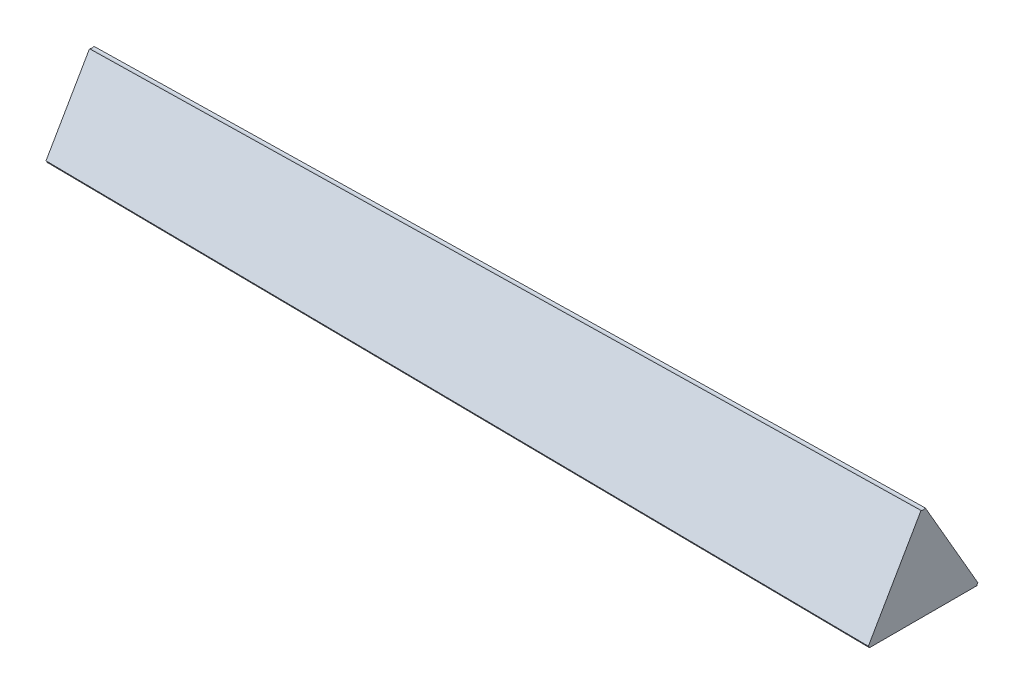
ISO-10303-21;
HEADER;
FILE_DESCRIPTION(('STEP AP214'),'2;1');
FILE_NAME('part.step','',(''),(''),'','','');
FILE_SCHEMA(('AUTOMOTIVE_DESIGN { 1 0 10303 214 1 1 1 1 }'));
ENDSEC;
DATA;
#1=APPLICATION_CONTEXT('core data for automotive mechanical design processes');
#2=APPLICATION_PROTOCOL_DEFINITION('international standard','automotive_design',2000,#1);
#3=PRODUCT_CONTEXT('',#1,'mechanical');
#4=PRODUCT('Part','Part','',(#3));
#5=PRODUCT_RELATED_PRODUCT_CATEGORY('part','',(#4));
#6=PRODUCT_DEFINITION_FORMATION('','',#4);
#7=PRODUCT_DEFINITION_CONTEXT('part definition',#1,'design');
#8=PRODUCT_DEFINITION('design','',#6,#7);
#9=PRODUCT_DEFINITION_SHAPE('','',#8);
#10=(LENGTH_UNIT() NAMED_UNIT(*) SI_UNIT(.MILLI.,.METRE.));
#11=(NAMED_UNIT(*) PLANE_ANGLE_UNIT() SI_UNIT($,.RADIAN.));
#12=(NAMED_UNIT(*) SI_UNIT($,.STERADIAN.) SOLID_ANGLE_UNIT());
#13=UNCERTAINTY_MEASURE_WITH_UNIT(LENGTH_MEASURE(1.E-05),#10,'distance_accuracy_value','');
#14=(GEOMETRIC_REPRESENTATION_CONTEXT(3) GLOBAL_UNCERTAINTY_ASSIGNED_CONTEXT((#13)) GLOBAL_UNIT_ASSIGNED_CONTEXT((#10,
#11,#12)) REPRESENTATION_CONTEXT('',''));
#15=CARTESIAN_POINT('',(0.,0.,0.));
#16=DIRECTION('',(0.,0.,1.));
#17=DIRECTION('',(1.,0.,0.));
#18=AXIS2_PLACEMENT_3D('',#15,#16,#17);
#19=CARTESIAN_POINT('',(6096.,200.,0.));
#20=DIRECTION('',(-1.,0.,0.));
#21=DIRECTION('',(0.,-1.,0.));
#22=AXIS2_PLACEMENT_3D('',#19,#20,#21);
#23=PLANE('',#22);
#24=CARTESIAN_POINT('',(6096.,0.,82.0018386876281));
#25=DIRECTION('',(1.,0.,0.));
#26=DIRECTION('',(0.,1.,0.));
#27=AXIS2_PLACEMENT_3D('',#24,#25,#26);
#28=CIRCLE('',#27,3.2258);
#29=CARTESIAN_POINT('',(6096.,0.,78.7760386876281));
#30=VERTEX_POINT('',#29);
#31=CARTESIAN_POINT('',(6096.,2.79348621840737,80.3886987719457));
#32=VERTEX_POINT('',#31);
#33=EDGE_CURVE('E140',#30,#32,#28,.T.);
#34=ORIENTED_EDGE('',*,*,#33,.F.);
#35=DIRECTION('',(0.,0.,-1.));
#36=VECTOR('',#35,1.);
#37=CARTESIAN_POINT('',(6096.,0.,0.));
#38=LINE('',#37,#36);
#39=CARTESIAN_POINT('',(6096.,0.,-78.7760386876281));
#40=VERTEX_POINT('',#39);
#41=EDGE_CURVE('E146',#30,#40,#38,.T.);
#42=ORIENTED_EDGE('',*,*,#41,.T.);
#43=CARTESIAN_POINT('',(6096.,0.,-82.0018386876281));
#44=DIRECTION('',(1.,0.,0.));
#45=DIRECTION('',(0.,1.,0.));
#46=AXIS2_PLACEMENT_3D('',#43,#44,#45);
#47=CIRCLE('',#46,3.2258);
#48=CARTESIAN_POINT('',(6096.,2.79348621840737,-80.3886987719456));
#49=VERTEX_POINT('',#48);
#50=EDGE_CURVE('E248',#49,#40,#47,.T.);
#51=ORIENTED_EDGE('',*,*,#50,.F.);
#52=CARTESIAN_POINT('',(6096.,0.,-82.0018386876281));
#53=CARTESIAN_POINT('',(6096.,13.7748221333112,-74.04736399996));
#54=CARTESIAN_POINT('',(6096.,27.5496442666224,-66.0928893122919));
#55=CARTESIAN_POINT('',(6096.,55.0992885332448,-50.1839399369556));
#56=CARTESIAN_POINT('',(6096.,68.8741106665559,-42.2294652492875));
#57=CARTESIAN_POINT('',(6096.,102.43368361185,-22.8499937077462));
#58=CARTESIAN_POINT('',(6096.,122.218434423834,-11.4249968538731));
#59=CARTESIAN_POINT('',(6096.,142.003185235817,0.));
#60=B_SPLINE_CURVE_WITH_KNOTS('',3,(#52,#53,#54,#55,#56,#57,#58,#59),.UNSPECIFIED.,.F.,.F.,(4,2,
2,4),(0.,47.7197499076642,95.4394998153284,163.979285781069),.UNSPECIFIED.);
#61=CARTESIAN_POINT('',(6096.,136.504196616905,-3.17547227496557));
#62=VERTEX_POINT('',#61);
#63=EDGE_CURVE('E194',#49,#62,#60,.T.);
#64=ORIENTED_EDGE('',*,*,#63,.T.);
#65=CARTESIAN_POINT('',(6096.,142.003185235817,0.));
#66=DIRECTION('',(1.,0.,0.));
#67=DIRECTION('',(0.,1.,0.));
#68=AXIS2_PLACEMENT_3D('',#65,#66,#67);
#69=CIRCLE('',#68,6.35);
#70=CARTESIAN_POINT('',(6096.,136.504196616905,3.17547227496557));
#71=VERTEX_POINT('',#70);
#72=EDGE_CURVE('E258',#71,#62,#69,.T.);
#73=ORIENTED_EDGE('',*,*,#72,.F.);
#74=CARTESIAN_POINT('',(6096.,142.003185235817,0.));
#75=CARTESIAN_POINT('',(6096.,128.228363102506,7.95447468766816));
#76=CARTESIAN_POINT('',(6096.,114.453540969194,15.9089493753363));
#77=CARTESIAN_POINT('',(6096.,86.903896702572,31.8178987506726));
#78=CARTESIAN_POINT('',(6096.,73.1290745692608,39.7723734383407));
#79=CARTESIAN_POINT('',(6096.,39.5695016239664,59.1518449798819));
#80=CARTESIAN_POINT('',(6096.,19.7847508119832,70.576841833755));
#81=CARTESIAN_POINT('',(6096.,0.,82.0018386876282));
#82=B_SPLINE_CURVE_WITH_KNOTS('',3,(#74,#75,#76,#77,#78,#79,#80,#81),.UNSPECIFIED.,.F.,.F.,(4,2,
2,4),(0.,47.7197499076642,95.4394998153285,163.979285781069),.UNSPECIFIED.);
#83=EDGE_CURVE('E187',#71,#32,#82,.T.);
#84=ORIENTED_EDGE('',*,*,#83,.T.);
#85=EDGE_LOOP('',(#34,#42,#51,#64,#73,#84));
#86=FACE_BOUND('',#85,.T.);
#87=ADVANCED_FACE('F120',(#86),#23,.F.);
#88=CARTESIAN_POINT('',(4876.8,200.,0.));
#89=DIRECTION('',(-1.,0.,0.));
#90=DIRECTION('',(0.,-1.,0.));
#91=AXIS2_PLACEMENT_3D('',#88,#89,#90);
#92=PLANE('',#91);
#93=DIRECTION('',(0.,0.,-1.));
#94=VECTOR('',#93,1.);
#95=CARTESIAN_POINT('',(4876.8,0.,0.));
#96=LINE('',#95,#94);
#97=CARTESIAN_POINT('',(4876.8,0.,65.3256709501025));
#98=VERTEX_POINT('',#97);
#99=CARTESIAN_POINT('',(4876.8,0.,-65.3256709501025));
#100=VERTEX_POINT('',#99);
#101=EDGE_CURVE('E191',#98,#100,#96,.T.);
#102=ORIENTED_EDGE('',*,*,#101,.F.);
#103=CARTESIAN_POINT('',(4876.8,0.,68.5514709501025));
#104=DIRECTION('',(-1.,0.,0.));
#105=DIRECTION('',(0.,0.,1.));
#106=AXIS2_PLACEMENT_3D('',#103,#104,#105);
#107=CIRCLE('',#106,3.2258);
#108=CARTESIAN_POINT('',(4876.8,2.7934359788372,66.9382440373163));
#109=VERTEX_POINT('',#108);
#110=EDGE_CURVE('E179',#109,#98,#107,.T.);
#111=ORIENTED_EDGE('',*,*,#110,.F.);
#112=CARTESIAN_POINT('',(4876.8,118.702548188653,0.));
#113=CARTESIAN_POINT('',(4876.8,104.927973789209,7.95490367479582));
#114=CARTESIAN_POINT('',(4876.8,91.1533993897643,15.9098073495917));
#115=CARTESIAN_POINT('',(4876.8,64.4823541585998,31.31250434534));
#116=CARTESIAN_POINT('',(4876.8,51.5858833268799,38.7602976662925));
#117=CARTESIAN_POINT('',(4876.8,25.7929416634399,53.6558843081975));
#118=CARTESIAN_POINT('',(4876.8,12.89647083172,61.10367762915));
#119=CARTESIAN_POINT('',(4876.8,0.,68.5514709501025));
#120=B_SPLINE_CURVE_WITH_KNOTS('',3,(#112,#113,#114,#115,#116,#117,#118,#119),.UNSPECIFIED.,.F.,
.F.,(4,2,2,4),(0.,47.7197499076642,92.3974542733236,137.075158638983),.UNSPECIFIED.);
#121=CARTESIAN_POINT('',(4876.8,113.203658466533,3.17564352910663));
#122=VERTEX_POINT('',#121);
#123=EDGE_CURVE('E233',#122,#109,#120,.T.);
#124=ORIENTED_EDGE('',*,*,#123,.F.);
#125=CARTESIAN_POINT('',(4876.8,118.702548188653,0.));
#126=DIRECTION('',(-1.,0.,0.));
#127=DIRECTION('',(0.,0.,1.));
#128=AXIS2_PLACEMENT_3D('',#125,#126,#127);
#129=CIRCLE('',#128,6.35);
#130=CARTESIAN_POINT('',(4876.8,113.203658466533,-3.17564352910661));
#131=VERTEX_POINT('',#130);
#132=EDGE_CURVE('E244',#131,#122,#129,.T.);
#133=ORIENTED_EDGE('',*,*,#132,.F.);
#134=CARTESIAN_POINT('',(4876.8,0.,-68.5514709501025));
#135=CARTESIAN_POINT('',(4876.8,13.7745743994445,-60.5965672753067));
#136=CARTESIAN_POINT('',(4876.8,27.5491487988891,-52.6416636005109));
#137=CARTESIAN_POINT('',(4876.8,54.2201940300536,-37.2389666047626));
#138=CARTESIAN_POINT('',(4876.8,67.1166648617735,-29.79117328381));
#139=CARTESIAN_POINT('',(4876.8,92.9096065252135,-14.895586641905));
#140=CARTESIAN_POINT('',(4876.8,105.806077356933,-7.44779332095248));
#141=CARTESIAN_POINT('',(4876.8,118.702548188653,0.));
#142=B_SPLINE_CURVE_WITH_KNOTS('',3,(#134,#135,#136,#137,#138,#139,#140,#141),.UNSPECIFIED.,.F.,
.F.,(4,2,2,4),(0.,47.7197499076642,92.3974542733236,137.075158638983),.UNSPECIFIED.);
#143=CARTESIAN_POINT('',(4876.8,2.79343597883728,-66.9382440373163));
#144=VERTEX_POINT('',#143);
#145=EDGE_CURVE('E210',#144,#131,#142,.T.);
#146=ORIENTED_EDGE('',*,*,#145,.F.);
#147=CARTESIAN_POINT('',(4876.8,0.,-68.5514709501025));
#148=DIRECTION('',(-1.,0.,1.3766793038938E-13));
#149=DIRECTION('',(1.3766793038938E-13,0.,1.));
#150=AXIS2_PLACEMENT_3D('',#147,#148,#149);
#151=CIRCLE('',#150,3.2258);
#152=EDGE_CURVE('E182',#100,#144,#151,.T.);
#153=ORIENTED_EDGE('',*,*,#152,.F.);
#154=EDGE_LOOP('',(#102,#111,#124,#133,#146,#153));
#155=FACE_BOUND('',#154,.T.);
#156=ADVANCED_FACE('F222',(#155),#92,.T.);
#157=CARTESIAN_POINT('',(0.,0.,14.75));
#158=DIRECTION('',(0.,-1.,0.));
#159=DIRECTION('',(0.,0.,-1.));
#160=AXIS2_PLACEMENT_3D('',#157,#158,#159);
#161=PLANE('',#160);
#162=ORIENTED_EDGE('',*,*,#41,.F.);
#163=DIRECTION('',(-0.999939151654741,0.,-0.0110314544823701));
#164=VECTOR('',#163,1.);
#165=CARTESIAN_POINT('',(5486.4,0.,72.0508548188653));
#166=LINE('',#165,#164);
#167=EDGE_CURVE('E176',#30,#98,#166,.T.);
#168=ORIENTED_EDGE('',*,*,#167,.T.);
#169=ORIENTED_EDGE('',*,*,#101,.T.);
#170=DIRECTION('',(-0.999939151654741,0.,0.0110314544823701));
#171=VECTOR('',#170,1.);
#172=CARTESIAN_POINT('',(5486.4,0.,-72.0508548188653));
#173=LINE('',#172,#171);
#174=EDGE_CURVE('E133',#100,#40,#173,.F.);
#175=ORIENTED_EDGE('',*,*,#174,.T.);
#176=EDGE_LOOP('',(#162,#168,#169,#175));
#177=FACE_BOUND('',#176,.T.);
#178=ADVANCED_FACE('F122',(#177),#161,.T.);
#179=CARTESIAN_POINT('',(0.,25.5,0.));
#180=CARTESIAN_POINT('',(2438.33333333333,72.1,0.));
#181=CARTESIAN_POINT('',(4876.66666666667,118.7,0.));
#182=CARTESIAN_POINT('',(7315.,165.3,0.));
#183=CARTESIAN_POINT('',(0.,23.375,1.22916666666666));
#184=CARTESIAN_POINT('',(2438.33333333333,66.0916666666667,3.47083333333334));
#185=CARTESIAN_POINT('',(4876.66666666667,108.808333333333,5.71250000000001));
#186=CARTESIAN_POINT('',(7315.,151.525,7.95416666666669));
#187=CARTESIAN_POINT('',(0.,19.125,3.68749999999999));
#188=CARTESIAN_POINT('',(2438.33333333333,54.075,10.4125));
#189=CARTESIAN_POINT('',(4876.66666666667,89.0250000000001,17.1375));
#190=CARTESIAN_POINT('',(7315.,123.975,23.8625));
#191=CARTESIAN_POINT('',(0.,12.75,7.37500000000001));
#192=CARTESIAN_POINT('',(2438.33333333333,36.0499999999999,20.825));
#193=CARTESIAN_POINT('',(4876.66666666667,59.3499999999999,34.275));
#194=CARTESIAN_POINT('',(7315.,82.6499999999999,47.725));
#195=CARTESIAN_POINT('',(0.,6.375,11.0625));
#196=CARTESIAN_POINT('',(2438.33333333333,18.025,31.2375));
#197=CARTESIAN_POINT('',(4876.66666666666,29.675,51.4125));
#198=CARTESIAN_POINT('',(7314.99999999999,41.3250000000001,71.5875));
#199=CARTESIAN_POINT('',(0.,2.125,13.5208333333333));
#200=CARTESIAN_POINT('',(2438.33333333333,6.00833333333333,38.1791666666667));
#201=CARTESIAN_POINT('',(4876.66666666667,9.89166666666667,62.8375));
#202=CARTESIAN_POINT('',(7315.,13.775,87.4958333333333));
#203=CARTESIAN_POINT('',(0.,0.,14.75));
#204=CARTESIAN_POINT('',(2438.33333333333,0.,41.65));
#205=CARTESIAN_POINT('',(4876.66666666667,0.,68.55));
#206=CARTESIAN_POINT('',(7315.,0.,95.45));
#207=B_SPLINE_SURFACE_WITH_KNOTS('',3,3,((#179,#180,#181,#182),(#183,#184,#185,#186),(#187,#188,
#189,#190),(#191,#192,#193,#194),(#195,#196,#197,#198),(#199,#200,#201,#202),(#203,#204,#205,
#206)),.UNSPECIFIED.,.F.,.F.,.F.,(4,1,1,1,4),(4,4),(0.,0.0833123226738553,0.166624645347711,
0.249936968021566,0.333249290695421),(0.,1.),.UNSPECIFIED.);
#208=CARTESIAN_POINT('',(4876.8,2.7934359788372,66.9382440373163));
#209=CARTESIAN_POINT('',(4878.95014078602,2.79343608483086,66.9619648444254));
#210=CARTESIAN_POINT('',(4881.10028157203,2.79343619071443,66.9856856513439));
#211=CARTESIAN_POINT('',(4891.85098550211,2.79343671958356,67.1042896849866));
#212=CARTESIAN_POINT('',(4900.4515486462,2.79343714092293,67.1991729088612));
#213=CARTESIAN_POINT('',(4913.35239336239,2.79343777033079,67.3414977401704));
#214=CARTESIAN_POINT('',(4917.65267493447,2.79343797969988,67.3889393498564));
#215=CARTESIAN_POINT('',(4930.55351965071,2.79343860651454,67.5312641766768));
#216=CARTESIAN_POINT('',(4939.1540827949,2.7934390226675,67.6261473915737));
#217=CARTESIAN_POINT('',(4952.05492751124,2.79343964434351,67.7684722094992));
#218=CARTESIAN_POINT('',(4956.35520908337,2.79343985114327,67.8159138147376));
#219=CARTESIAN_POINT('',(4969.25605379975,2.79344047027365,67.9582386282565));
#220=CARTESIAN_POINT('',(4977.85661694404,2.79344088133535,68.0531218343405));
#221=CARTESIAN_POINT('',(4990.75746166053,2.79344149542108,68.195446639127));
#222=CARTESIAN_POINT('',(4995.0577432327,2.79344169969852,68.2428882399993));
#223=CARTESIAN_POINT('',(5007.95858794923,2.79344231128507,68.3852130404597));
#224=CARTESIAN_POINT('',(5016.55915109362,2.79344271734839,68.4800962378913));
#225=CARTESIAN_POINT('',(5029.45999581025,2.79344332398198,68.6224210297782));
#226=CARTESIAN_POINT('',(5033.76027738246,2.79344352578295,68.6698626263637));
#227=CARTESIAN_POINT('',(5046.66112209914,2.79344412996266,68.8121874140029));
#228=CARTESIAN_POINT('',(5055.26168524362,2.79344453111821,68.907070602939));
#229=CARTESIAN_POINT('',(5068.16252996039,2.79344513043456,69.0493953821595));
#230=CARTESIAN_POINT('',(5072.46281153265,2.79344532980385,69.0968369745357));
#231=CARTESIAN_POINT('',(5085.36365624946,2.79344592671053,69.2391617495849));
#232=CARTESIAN_POINT('',(5093.96421939404,2.79344632304674,69.3340449301787));
#233=CARTESIAN_POINT('',(5106.86506411094,2.7934469151774,69.4763696969606));
#234=CARTESIAN_POINT('',(5111.16534568325,2.79344711215867,69.5238112852031));
#235=CARTESIAN_POINT('',(5124.0661904002,2.79344770192282,69.6661360478885));
#236=CARTESIAN_POINT('',(5132.66675354486,2.79344809352602,69.7610192202892));
#237=CARTESIAN_POINT('',(5145.5675982619,2.79344867859948,69.9033439748548));
#238=CARTESIAN_POINT('',(5149.86787983426,2.79344887323541,69.9507855590374));
#239=CARTESIAN_POINT('',(5162.76872455134,2.79344945598449,70.0931103095793));
#240=CARTESIAN_POINT('',(5171.36928769609,2.79344984293893,70.187993473933));
#241=CARTESIAN_POINT('',(5184.27013241326,2.79345042108059,70.3303182164993));
#242=CARTESIAN_POINT('',(5188.57041398566,2.79345061341281,70.377759796694));
#243=CARTESIAN_POINT('',(5201.47125870288,2.79345118927125,70.520084535308));
#244=CARTESIAN_POINT('',(5210.07182184771,2.79345157165923,70.6149676917569));
#245=CARTESIAN_POINT('',(5222.97266656502,2.79345214299155,70.757292422536));
#246=CARTESIAN_POINT('',(5227.27294813746,2.79345233306071,70.8047339988133));
#247=CARTESIAN_POINT('',(5240.1737928548,2.79345290215,70.9470587257095));
#248=CARTESIAN_POINT('',(5248.77435599972,2.79345328005191,71.0419418743927));
#249=CARTESIAN_POINT('',(5261.67520071715,2.79345384469449,71.1842665935914));
#250=CARTESIAN_POINT('',(5265.97548228964,2.7934540325403,71.23170816602));
#251=CARTESIAN_POINT('',(5274.57604543462,2.79345440749948,71.3265913096092));
#252=CARTESIAN_POINT('',(5278.87632700711,2.79345459461285,71.3740328807698));
#253=CARTESIAN_POINT('',(5291.77717172463,2.79345515486068,71.516357592361));
#254=CARTESIAN_POINT('',(5300.37773486966,2.79345552690289,71.6112407309007));
#255=CARTESIAN_POINT('',(5313.27857958726,2.79345608280707,71.7535654349727));
#256=CARTESIAN_POINT('',(5317.5788611598,2.79345626774862,71.8010070023738));
#257=CARTESIAN_POINT('',(5330.47970587743,2.79345682149991,71.943331702719));
#258=CARTESIAN_POINT('',(5339.08026902255,2.79345718923634,72.0382148338051));
#259=CARTESIAN_POINT('',(5351.98111374027,2.79345773871913,72.1805395267613));
#260=CARTESIAN_POINT('',(5356.28139531285,2.79345792152643,72.2279810904678));
#261=CARTESIAN_POINT('',(5369.18224003061,2.7934584688935,72.3703057797615));
#262=CARTESIAN_POINT('',(5377.78280317581,2.79345883239847,72.4651889035226));
#263=CARTESIAN_POINT('',(5390.68364789365,2.79345937557051,72.6075135855544));
#264=CARTESIAN_POINT('',(5394.98392946627,2.79345955628029,72.65495514563));
#265=CARTESIAN_POINT('',(5407.88477418415,2.79346009737291,72.7972798240621));
#266=CARTESIAN_POINT('',(5416.48533732943,2.79346045671903,72.892162940624));
#267=CARTESIAN_POINT('',(5429.38618204738,2.79346099368845,73.0344876119184));
#268=CARTESIAN_POINT('',(5433.68646362004,2.79346117233663,73.0819291684252));
#269=CARTESIAN_POINT('',(5446.58730833804,2.79346170726208,73.2242538361814));
#270=CARTESIAN_POINT('',(5455.1878714834,2.79346206252029,73.3191369456668));
#271=CARTESIAN_POINT('',(5468.08871620147,2.79346259339268,73.4614616064068));
#272=CARTESIAN_POINT('',(5472.38899777417,2.79346277001432,73.5089031594055));
#273=CARTESIAN_POINT('',(5485.28984249228,2.79346329887746,73.6512278166673));
#274=CARTESIAN_POINT('',(5493.89040563772,2.79346365011717,73.7461109191963));
#275=CARTESIAN_POINT('',(5506.7912503559,2.79346417499581,73.8884355695605));
#276=CARTESIAN_POINT('',(5511.09153192864,2.79346434962519,73.9358771191104));
#277=CARTESIAN_POINT('',(5523.99237664687,2.79346487252846,74.0782017660551));
#278=CARTESIAN_POINT('',(5532.59293979237,2.79346521981745,74.173084861745));
#279=CARTESIAN_POINT('',(5545.49378451068,2.79346573880327,74.3154095019082));
#280=CARTESIAN_POINT('',(5549.79406608345,2.79346591147394,74.3628510480673));
#281=CARTESIAN_POINT('',(5562.69491080179,2.79346642851755,74.5051756848683));
#282=CARTESIAN_POINT('',(5571.29547394737,2.79346677192213,74.6000587738338));
#283=CARTESIAN_POINT('',(5584.19631866578,2.7934672851138,74.7423834039668));
#284=CARTESIAN_POINT('',(5588.49660023859,2.79346745585848,74.7898249467919));
#285=CARTESIAN_POINT('',(5601.39744495704,2.79346796714033,74.9321495736187));
#286=CARTESIAN_POINT('',(5609.9980081027,2.79346830672527,75.0270326559721));
#287=CARTESIAN_POINT('',(5622.89885282122,2.79346881421932,75.1693572762417));
#288=CARTESIAN_POINT('',(5627.19913439407,2.79346898307011,75.2167988157882));
#289=CARTESIAN_POINT('',(5640.09997911262,2.79346948868603,75.3591234328067));
#290=CARTESIAN_POINT('',(5648.70054225835,2.79346982451471,75.4540065086575));
#291=CARTESIAN_POINT('',(5661.60138697698,2.79347032640546,75.5963311192273));
#292=CARTESIAN_POINT('',(5665.90166854986,2.79347049339367,75.6437726555494));
#293=CARTESIAN_POINT('',(5674.50223169563,2.79347082675608,75.7386557271309));
#294=CARTESIAN_POINT('',(5678.80251326853,2.79347099313029,75.7860972623901));
#295=CARTESIAN_POINT('',(5691.70335798723,2.79347149133696,75.9284218665822));
#296=CARTESIAN_POINT('',(5700.30392113305,2.79347182225347,76.0233049339295));
#297=CARTESIAN_POINT('',(5713.20476585182,2.7934723168164,76.1656295318139));
#298=CARTESIAN_POINT('',(5717.50504742474,2.79347248136874,76.2130710639193));
#299=CARTESIAN_POINT('',(5730.40589214355,2.7934729741248,76.3553956586757));
#300=CARTESIAN_POINT('',(5739.00645528944,2.79347330142757,76.4502787197672));
#301=CARTESIAN_POINT('',(5751.90730000831,2.79347379059946,76.5926033083189));
#302=CARTESIAN_POINT('',(5756.20758158127,2.7934739533597,76.6400448373219));
#303=CARTESIAN_POINT('',(5769.10842630017,2.79347444075416,76.7823694227967));
#304=CARTESIAN_POINT('',(5777.70898944613,2.79347476450207,76.8772524777342));
#305=CARTESIAN_POINT('',(5790.6098341651,2.79347524837055,77.0195770571051));
#306=CARTESIAN_POINT('',(5794.9101157381,2.79347540936782,77.0670185830561));
#307=CARTESIAN_POINT('',(5807.81096045711,2.79347589148766,77.2093431593999));
#308=CARTESIAN_POINT('',(5816.41152360313,2.79347621173828,77.3042262082831));
#309=CARTESIAN_POINT('',(5829.3123683222,2.79347669038916,77.4465507786216));
#310=CARTESIAN_POINT('',(5833.61264989523,2.79347684965194,77.49399230157));
#311=CARTESIAN_POINT('',(5846.51349461434,2.79347732658238,77.6363168689301));
#312=CARTESIAN_POINT('',(5855.11405776043,2.79347764339212,77.7311999118566));
#313=CARTESIAN_POINT('',(5868.0149024796,2.79347811690932,77.8735244733079));
#314=CARTESIAN_POINT('',(5872.31518405266,2.79347827446549,77.9209659933019));
#315=CARTESIAN_POINT('',(5885.21602877186,2.79347874628983,78.0632905518226));
#316=CARTESIAN_POINT('',(5893.81659191802,2.79347905971385,78.158173588888));
#317=CARTESIAN_POINT('',(5906.71743663728,2.79347952817952,78.3004981415944));
#318=CARTESIAN_POINT('',(5911.01771821038,2.79347968405635,78.3479396586812));
#319=CARTESIAN_POINT('',(5923.91856292967,2.79348015085615,78.4902642085037));
#320=CARTESIAN_POINT('',(5932.51912607589,2.79348046094841,78.5851472398012));
#321=CARTESIAN_POINT('',(5945.41997079525,2.79348092444299,78.7274717839018));
#322=CARTESIAN_POINT('',(5949.72025236838,2.79348107866721,78.7749132981277));
#323=CARTESIAN_POINT('',(5962.62109708777,2.79348154052233,78.9172378393902));
#324=CARTESIAN_POINT('',(5971.22166023406,2.79348184733568,79.0121208650114));
#325=CARTESIAN_POINT('',(5984.12250495351,2.79348230593784,79.1544454006424));
#326=CARTESIAN_POINT('',(5988.42278652667,2.79348245853558,79.2018869120527));
#327=CARTESIAN_POINT('',(6001.32363124615,2.79348291552414,79.3442114448903));
#328=CARTESIAN_POINT('',(6009.9241943925,2.7934832191103,79.4390944649247));
#329=CARTESIAN_POINT('',(6022.82503911204,2.79348367289712,79.5814189922196));
#330=CARTESIAN_POINT('',(6027.12532068523,2.79348382389398,79.6288605008585));
#331=CARTESIAN_POINT('',(6040.02616540481,2.79348427609253,79.7711850254038));
#332=CARTESIAN_POINT('',(6048.62672855121,2.79348457650215,79.8660680399391));
#333=CARTESIAN_POINT('',(6061.52757327085,2.79348502554905,80.0083925590284));
#334=CARTESIAN_POINT('',(6065.82785484406,2.7934851749701,80.0558340649392));
#335=CARTESIAN_POINT('',(6078.75209094484,2.7934856232649,80.1984166393851));
#336=CARTESIAN_POINT('',(6087.37604547241,2.7934859213533,80.2935577065607));
#337=CARTESIAN_POINT('',(6096.,2.79348621840737,80.3886987719456));
#338=B_SPLINE_CURVE_WITH_KNOTS('',3,(#208,#209,#210,#211,#212,#213,#214,#215,#216,#217,#218,
#219,#220,#221,#222,#223,#224,#225,#226,#227,#228,#229,#230,#231,#232,#233,#234,#235,#236,#237,
#238,#239,#240,#241,#242,#243,#244,#245,#246,#247,#248,#249,#250,#251,#252,#253,#254,#255,#256,
#257,#258,#259,#260,#261,#262,#263,#264,#265,#266,#267,#268,#269,#270,#271,#272,#273,#274,#275,
#276,#277,#278,#279,#280,#281,#282,#283,#284,#285,#286,#287,#288,#289,#290,#291,#292,#293,#294,
#295,#296,#297,#298,#299,#300,#301,#302,#303,#304,#305,#306,#307,#308,#309,#310,#311,#312,#313,
#314,#315,#316,#317,#318,#319,#320,#321,#322,#323,#324,#325,#326,#327,#328,#329,#330,#331,#332,
#333,#334,#335,#336,#337),.UNSPECIFIED.,.F.,.F.,(4,2,2,2,2,2,2,2,2,2,2,2,2,2,2,2,2,2,2,2,2,2,2,
2,2,2,2,2,2,2,2,2,2,2,2,2,2,2,2,2,2,2,2,2,2,2,2,2,2,2,2,2,2,2,2,2,2,2,2,2,2,2,2,2,4),(0.,
6.45081488551891,32.2540744275936,45.1557041986308,70.9589637407067,83.8605935117434,
109.663853053818,122.565482824856,148.368742366931,161.270372137969,187.073631680044,
199.975261451081,225.778520993156,238.680150764194,264.483410306269,277.385040077306,
303.188299619381,316.089929390418,341.893188932493,354.794818703529,380.598078245602,
393.499708016641,406.401337787678,432.204597329752,445.106227100789,470.909486642863,
483.811116413901,509.614375955976,522.516005727012,548.319265269085,561.220895040123,
587.024154582197,599.925784353235,625.729043895309,638.630673666347,664.433933208421,
677.335562979459,703.138822521534,716.040452292571,741.843711834646,754.745341605683,
780.548601147759,793.450230918795,806.351860689832,832.155120231907,845.056750002945,
870.86000954502,883.761639316056,909.564898858131,922.466528629168,948.269788171242,
961.17141794228,986.974677484353,999.87630725539,1025.67956679747,1038.5811965685,
1064.38445611058,1077.28608588161,1103.08934542369,1115.99097519473,1141.7942347368,
1154.69586450784,1180.49912404991,1193.40075382095,1219.27419177663),.UNSPECIFIED.);
#339=EDGE_CURVE('E13',#109,#32,#338,.T.);
#340=CARTESIAN_POINT('',(6096.,136.504196616905,3.17547227496563));
#341=CARTESIAN_POINT('',(6091.76864200555,136.423329665588,3.17547277180914));
#342=CARTESIAN_POINT('',(6087.5372840111,136.342462714762,3.17547326950126));
#343=CARTESIAN_POINT('',(6066.38049403878,135.938127963092,3.1754757622271));
#344=CARTESIAN_POINT('',(6049.45506206077,135.614660169637,3.17547777005653));
#345=CARTESIAN_POINT('',(6015.60419810445,134.967724598814,3.17548181358023));
#346=CARTESIAN_POINT('',(5998.67876612613,134.644256821446,3.17548384927451));
#347=CARTESIAN_POINT('',(5973.29061815842,134.159055167715,3.17548692415326));
#348=CARTESIAN_POINT('',(5964.82790216915,133.997321285191,3.17548795266906));
#349=CARTESIAN_POINT('',(5939.4397542012,133.512119643843,3.17549104899685));
#350=CARTESIAN_POINT('',(5922.51432222241,133.188651891243,3.17549312758922));
#351=CARTESIAN_POINT('',(5897.12617425399,132.703450275056,3.17549626749539));
#352=CARTESIAN_POINT('',(5888.66345826447,132.541716405113,3.17549731780038));
#353=CARTESIAN_POINT('',(5863.2753102958,132.056514801705,3.17550047984076));
#354=CARTESIAN_POINT('',(5846.34987831653,131.733047074665,3.17550260270155));
#355=CARTESIAN_POINT('',(5820.96173034736,131.247845497226,3.17550580971995));
#356=CARTESIAN_POINT('',(5812.49901435759,131.086111640267,3.17550688251395));
#357=CARTESIAN_POINT('',(5787.11086638818,130.600910076021,3.17551011238123));
#358=CARTESIAN_POINT('',(5770.18543440839,130.277442375365,3.1755122809398));
#359=CARTESIAN_POINT('',(5744.79728643846,129.792240837931,3.17551555724531));
#360=CARTESIAN_POINT('',(5736.33457044844,129.630506994378,3.17551665325843));
#361=CARTESIAN_POINT('',(5710.94642247825,129.145305470568,3.17551995315864));
#362=CARTESIAN_POINT('',(5694.02099049795,128.821837797158,3.17552216890658));
#363=CARTESIAN_POINT('',(5668.63284252723,128.336636301039,3.17552551676912));
#364=CARTESIAN_POINT('',(5660.17012653695,128.174902471332,3.17552663676341));
#365=CARTESIAN_POINT('',(5634.78197856596,127.689700989287,3.17553000899923));
#366=CARTESIAN_POINT('',(5617.85654658512,127.366233344022,3.17553227349373));
#367=CARTESIAN_POINT('',(5592.46839861358,126.881031890588,3.17553569528349));
#368=CARTESIAN_POINT('',(5584.00568262302,126.719298075187,3.17553684005474));
#369=CARTESIAN_POINT('',(5558.61753465121,126.234096636294,3.17554028703102));
#370=CARTESIAN_POINT('',(5541.69210266981,125.910629020114,3.17554260189857));
#371=CARTESIAN_POINT('',(5516.30395469743,125.425427610794,3.17554610009147));
#372=CARTESIAN_POINT('',(5507.84123870659,125.263693810179,3.17554727047103));
#373=CARTESIAN_POINT('',(5482.45309073392,124.778492415891,3.17555079470031));
#374=CARTESIAN_POINT('',(5465.52765875195,124.455024829777,3.1755531616406));
#375=CARTESIAN_POINT('',(5440.1395107787,123.969823466065,3.17555673882452));
#376=CARTESIAN_POINT('',(5431.67679478757,123.808089680738,3.1755579356814));
#377=CARTESIAN_POINT('',(5406.28864681402,123.322888332572,3.17556153979017));
#378=CARTESIAN_POINT('',(5389.36321483145,122.999420777551,3.17556396058017));
#379=CARTESIAN_POINT('',(5363.9750668573,122.51421946101,3.17556761946104));
#380=CARTESIAN_POINT('',(5355.51235086587,122.352485691495,3.17556884370398));
#381=CARTESIAN_POINT('',(5330.12420289141,121.867284391037,3.17557253043912));
#382=CARTESIAN_POINT('',(5313.19877090823,121.543816868181,3.17557500693766));
#383=CARTESIAN_POINT('',(5287.81062293314,121.058615600446,3.17557875034658));
#384=CARTESIAN_POINT('',(5279.34790694139,120.896881847293,3.17558000292641));
#385=CARTESIAN_POINT('',(5253.95975896599,120.411680596203,3.17558377516225));
#386=CARTESIAN_POINT('',(5237.03432698217,120.088213106637,3.17558630931463));
#387=CARTESIAN_POINT('',(5211.64617900612,119.603011889419,3.17559014021492));
#388=CARTESIAN_POINT('',(5203.18346301405,119.441278153202,3.17559142212697));
#389=CARTESIAN_POINT('',(5177.79531503767,118.956076953218,3.17559528287265));
#390=CARTESIAN_POINT('',(5160.86988305319,118.632609498117,3.17559787671582));
#391=CARTESIAN_POINT('',(5135.48173507614,118.14740833321,3.17560179821104));
#392=CARTESIAN_POINT('',(5127.01901908373,117.985674614532,3.17560311049786));
#393=CARTESIAN_POINT('',(5101.63087110634,117.500473467473,3.17560706290551));
#394=CARTESIAN_POINT('',(5084.70543912118,117.177006048071,3.17560971857354));
#395=CARTESIAN_POINT('',(5059.3172911431,116.691804937351,3.17561373391572));
#396=CARTESIAN_POINT('',(5050.85457515034,116.530071236842,3.17561507766979));
#397=CARTESIAN_POINT('',(5025.4664271719,116.044870144618,3.17561912504289));
#398=CARTESIAN_POINT('',(5008.54099518604,115.721402762206,3.17562184477278));
#399=CARTESIAN_POINT('',(4983.15284720688,115.236201707644,3.17562595737157));
#400=CARTESIAN_POINT('',(4974.69013121376,115.074468025966,3.1756273337385));
#401=CARTESIAN_POINT('',(4951.32284601754,114.62788834711,3.17563114954077));
#402=CARTESIAN_POINT('',(4936.41827681431,114.343042356688,3.17563360067766));
#403=CARTESIAN_POINT('',(4906.60913840745,113.77335039622,3.17563853823901));
#404=CARTESIAN_POINT('',(4891.70456920383,113.488504426174,3.17564102466347));
#405=CARTESIAN_POINT('',(4876.8,113.203658466533,3.17564352910666));
#406=B_SPLINE_CURVE_WITH_KNOTS('',3,(#340,#341,#342,#343,#344,#345,#346,#347,#348,#349,#350,
#351,#352,#353,#354,#355,#356,#357,#358,#359,#360,#361,#362,#363,#364,#365,#366,#367,#368,#369,
#370,#371,#372,#373,#374,#375,#376,#377,#378,#379,#380,#381,#382,#383,#384,#385,#386,#387,#388,
#389,#390,#391,#392,#393,#394,#395,#396,#397,#398,#399,#400,#401,#402,#403,#404,#405),
.UNSPECIFIED.,.F.,.F.,(4,2,2,2,2,2,2,2,2,2,2,2,2,2,2,2,2,2,2,2,2,2,2,2,2,2,2,2,2,2,2,2,4),(0.,
12.6963919862583,63.4819599312983,114.26752787634,139.660311848858,190.445879793896,
215.838663766416,266.624231711456,292.017015683976,342.802583629014,368.195367601535,
418.980935546573,444.373719519092,495.159287464132,520.552071436652,571.337639381693,
596.730423354213,647.515991299255,672.908775271774,723.694343216813,749.087127189332,
799.872695134373,825.265479106894,876.051047051936,901.443831024456,952.229398969498,
977.622182942019,1028.40775088706,1053.80053485958,1104.58610280462,1129.97888677714,
1174.70075931565,1219.42263185416),.UNSPECIFIED.);
#407=EDGE_CURVE('E197',#71,#122,#406,.T.);
#408=ORIENTED_EDGE('',*,*,#123,.T.);
#409=ORIENTED_EDGE('',*,*,#339,.T.);
#410=ORIENTED_EDGE('',*,*,#83,.F.);
#411=ORIENTED_EDGE('',*,*,#407,.T.);
#412=EDGE_LOOP('',(#408,#409,#410,#411));
#413=FACE_BOUND('',#412,.T.);
#414=ADVANCED_FACE('F224',(#413),#207,.T.);
#415=CARTESIAN_POINT('',(0.,0.,-14.75));
#416=CARTESIAN_POINT('',(2438.33333333333,0.,-41.65));
#417=CARTESIAN_POINT('',(4876.66666666667,0.,-68.55));
#418=CARTESIAN_POINT('',(7315.,0.,-95.45));
#419=CARTESIAN_POINT('',(0.,2.125,-13.5208333333333));
#420=CARTESIAN_POINT('',(2438.33333333333,6.00833333333332,-38.1791666666667));
#421=CARTESIAN_POINT('',(4876.66666666667,9.89166666666665,-62.8375));
#422=CARTESIAN_POINT('',(7315.,13.775,-87.4958333333333));
#423=CARTESIAN_POINT('',(0.,6.37500000000001,-11.0625));
#424=CARTESIAN_POINT('',(2438.33333333334,18.025,-31.2375));
#425=CARTESIAN_POINT('',(4876.66666666667,29.6750000000001,-51.4125000000001));
#426=CARTESIAN_POINT('',(7315.00000000001,41.3250000000001,-71.5875));
#427=CARTESIAN_POINT('',(0.,12.75,-7.37499999999997));
#428=CARTESIAN_POINT('',(2438.33333333333,36.05,-20.825));
#429=CARTESIAN_POINT('',(4876.66666666666,59.3499999999999,-34.275));
#430=CARTESIAN_POINT('',(7314.99999999999,82.6499999999999,-47.725));
#431=CARTESIAN_POINT('',(0.,19.125,-3.68750000000001));
#432=CARTESIAN_POINT('',(2438.33333333333,54.075,-10.4125));
#433=CARTESIAN_POINT('',(4876.66666666667,89.025,-17.1375));
#434=CARTESIAN_POINT('',(7315.,123.975,-23.8625));
#435=CARTESIAN_POINT('',(0.,23.375,-1.22916666666666));
#436=CARTESIAN_POINT('',(2438.33333333333,66.0916666666667,-3.47083333333334));
#437=CARTESIAN_POINT('',(4876.66666666667,108.808333333333,-5.71250000000001));
#438=CARTESIAN_POINT('',(7315.,151.525,-7.95416666666669));
#439=CARTESIAN_POINT('',(0.,25.5,0.));
#440=CARTESIAN_POINT('',(2438.33333333333,72.1,0.));
#441=CARTESIAN_POINT('',(4876.66666666667,118.7,0.));
#442=CARTESIAN_POINT('',(7315.,165.3,0.));
#443=B_SPLINE_SURFACE_WITH_KNOTS('',3,3,((#415,#416,#417,#418),(#419,#420,#421,#422),(#423,#424,
#425,#426),(#427,#428,#429,#430),(#431,#432,#433,#434),(#435,#436,#437,#438),(#439,#440,#441,
#442)),.UNSPECIFIED.,.F.,.F.,.F.,(4,1,1,1,4),(4,4),(0.666750709304579,0.750063031978434,
0.833375354652289,0.916687677326145,1.),(0.,1.),.UNSPECIFIED.);
#444=CARTESIAN_POINT('',(6096.,2.79348621840734,-80.3886987719456));
#445=CARTESIAN_POINT('',(6093.84985921338,2.79348614434527,-80.3649780201127));
#446=CARTESIAN_POINT('',(6091.69971842676,2.7934860702189,-80.3412572681686));
#447=CARTESIAN_POINT('',(6080.94901449367,2.7934856992647,-80.2226535078898));
#448=CARTESIAN_POINT('',(6072.34845134721,2.79348540146985,-80.1277704978812));
#449=CARTESIAN_POINT('',(6059.44760662756,2.79348495321419,-79.9854459801617));
#450=CARTESIAN_POINT('',(6055.14732505435,2.79348480353508,-79.9380044738042));
#451=CARTESIAN_POINT('',(6042.24648033472,2.79348435371192,-79.795679953371));
#452=CARTESIAN_POINT('',(6033.64591718833,2.79348405278206,-79.7007969379351));
#453=CARTESIAN_POINT('',(6020.74507246877,2.79348359979906,-79.5584724120318));
#454=CARTESIAN_POINT('',(6016.44479089558,2.79348344854003,-79.5110309029391));
#455=CARTESIAN_POINT('',(6003.54394617605,2.79348299396463,-79.368706374279));
#456=CARTESIAN_POINT('',(5994.94338302972,2.79348268984997,-79.2738233533297));
#457=CARTESIAN_POINT('',(5982.04253831025,2.79348223206443,-79.1314988191124));
#458=CARTESIAN_POINT('',(5977.7422567371,2.79348207920032,-79.084057307241));
#459=CARTESIAN_POINT('',(5964.84141201766,2.79348161979696,-78.941732770223));
#460=CARTESIAN_POINT('',(5956.24084887139,2.79348131244668,-78.8468497436723));
#461=CARTESIAN_POINT('',(5943.34000415201,2.79348084978185,-78.7045252010081));
#462=CARTESIAN_POINT('',(5939.03972257889,2.793480695287,-78.6570836863136));
#463=CARTESIAN_POINT('',(5926.13887785954,2.79348023097838,-78.5147591408038));
#464=CARTESIAN_POINT('',(5917.53831471334,2.79347992034054,-78.4198761085618));
#465=CARTESIAN_POINT('',(5904.63746999405,2.793479452718,-78.277551557315));
#466=CARTESIAN_POINT('',(5900.33718842097,2.79347929656618,-78.230110039752));
#467=CARTESIAN_POINT('',(5887.43634370172,2.79347882727333,-78.0877854856137));
#468=CARTESIAN_POINT('',(5878.83578055557,2.79347851329488,-77.9929024475886));
#469=CARTESIAN_POINT('',(5865.93493583638,2.79347804063447,-77.8505778876205));
#470=CARTESIAN_POINT('',(5861.63465426333,2.79347788279887,-77.8031363671427));
#471=CARTESIAN_POINT('',(5848.73380954418,2.79347740844107,-77.6608118042362));
#472=CARTESIAN_POINT('',(5840.13324639809,2.79347709106787,-77.5659287603343));
#473=CARTESIAN_POINT('',(5827.23240167901,2.79347661328774,-77.4236041915032));
#474=CARTESIAN_POINT('',(5822.93212010598,2.79347645374098,-77.3761626680632));
#475=CARTESIAN_POINT('',(5810.03127538693,2.79347597423582,-77.2338380962458));
#476=CARTESIAN_POINT('',(5801.43071224091,2.79347565341253,-77.1389550463713));
#477=CARTESIAN_POINT('',(5788.52986752192,2.79347517042906,-76.9966304685325));
#478=CARTESIAN_POINT('',(5784.22958594893,2.79347500914315,-76.9491889420817));
#479=CARTESIAN_POINT('',(5771.32874122998,2.79347452440633,-76.8068643612076));
#480=CARTESIAN_POINT('',(5762.72817808403,2.79347420007633,-76.7119813052626));
#481=CARTESIAN_POINT('',(5749.82733336514,2.79347371180406,-76.5696567182681));
#482=CARTESIAN_POINT('',(5745.52705179218,2.79347354875043,-76.5222151887571));
#483=CARTESIAN_POINT('',(5732.62620707333,2.79347305869593,-76.3798905986774));
#484=CARTESIAN_POINT('',(5724.02564392745,2.79347273080145,-76.2850075365618));
#485=CARTESIAN_POINT('',(5711.12479920867,2.79347223715302,-76.1426829402605));
#486=CARTESIAN_POINT('',(5706.82451763574,2.79347207230242,-76.0952414076388));
#487=CARTESIAN_POINT('',(5698.22395448991,2.79347174199561,-76.0003583413469));
#488=CARTESIAN_POINT('',(5693.923672917,2.79347157653939,-75.9529168076769));
#489=CARTESIAN_POINT('',(5681.02282819828,2.79347107925736,-75.8105922050854));
#490=CARTESIAN_POINT('',(5672.42226505249,2.7934707465182,-75.7157091345828));
#491=CARTESIAN_POINT('',(5659.52142033385,2.79347024556232,-75.5733845256315));
#492=CARTESIAN_POINT('',(5655.22113876097,2.79347007826917,-75.5259429887814));
#493=CARTESIAN_POINT('',(5642.32029404236,2.79346957546107,-75.3836183766237));
#494=CARTESIAN_POINT('',(5633.71973089665,2.79346923901746,-75.2887352997084));
#495=CARTESIAN_POINT('',(5620.81888617811,2.79346873247402,-75.1464106810842));
#496=CARTESIAN_POINT('',(5616.51860460527,2.79346856331321,-75.098969141001));
#497=CARTESIAN_POINT('',(5603.61775988676,2.79346805488645,-74.9566445191166));
#498=CARTESIAN_POINT('',(5595.01719674112,2.79346771467618,-74.8617614356809));
#499=CARTESIAN_POINT('',(5582.11635202269,2.79346720245114,-74.7194368072213));
#500=CARTESIAN_POINT('',(5577.81607044989,2.79346703139118,-74.6719952638504));
#501=CARTESIAN_POINT('',(5564.91522573149,2.79346651725104,-74.5296706320756));
#502=CARTESIAN_POINT('',(5556.31466258592,2.79346617321057,-74.4347875420093));
#503=CARTESIAN_POINT('',(5543.4138178676,2.79346565520779,-74.2924629035479));
#504=CARTESIAN_POINT('',(5539.11353629483,2.79346548221652,-74.2450213568337));
#505=CARTESIAN_POINT('',(5526.21269157655,2.79346496226613,-74.1026967150006));
#506=CARTESIAN_POINT('',(5517.61212843106,2.79346461433046,-74.0078136181912));
#507=CARTESIAN_POINT('',(5504.71128371285,2.79346409045162,-73.8654889695578));
#508=CARTESIAN_POINT('',(5500.41100214012,2.79346391549611,-73.8180474194434));
#509=CARTESIAN_POINT('',(5487.51015742195,2.79346338963637,-73.6757227673809));
#510=CARTESIAN_POINT('',(5478.90959427653,2.79346303773889,-73.5808396637132));
#511=CARTESIAN_POINT('',(5466.00874955844,2.7934625078835,-73.4385150047337));
#512=CARTESIAN_POINT('',(5461.70846798574,2.79346233093018,-73.3910734511609));
#513=CARTESIAN_POINT('',(5448.80762326769,2.79346179905985,-73.2487487886934));
#514=CARTESIAN_POINT('',(5440.20706012234,2.79346144313249,-73.1538656780497));
#515=CARTESIAN_POINT('',(5427.30621540437,2.79346090719765,-73.0115410085461));
#516=CARTESIAN_POINT('',(5423.00593383172,2.79346072821207,-72.9640994514552));
#517=CARTESIAN_POINT('',(5410.10508911378,2.79346019022749,-72.8217747784034));
#518=CARTESIAN_POINT('',(5401.50452596851,2.79345983020067,-72.7268916606632));
#519=CARTESIAN_POINT('',(5388.60368125065,2.79345928808113,-72.5845669804534));
#520=CARTESIAN_POINT('',(5384.30339967804,2.79345910702806,-72.5371254197835));
#521=CARTESIAN_POINT('',(5371.40255496022,2.79345856282317,-72.3948007359638));
#522=CARTESIAN_POINT('',(5362.80199181503,2.79345819862565,-72.2999176110038));
#523=CARTESIAN_POINT('',(5349.90114709729,2.79345765021376,-72.1575929199015));
#524=CARTESIAN_POINT('',(5345.60086552472,2.79345746705719,-72.1101513555903));
#525=CARTESIAN_POINT('',(5332.70002080702,2.7934569165235,-71.967826660815));
#526=CARTESIAN_POINT('',(5324.09945766191,2.79345654808236,-71.872943528509));
#527=CARTESIAN_POINT('',(5311.1986129443,2.79345599326793,-71.7306188263234));
#528=CARTESIAN_POINT('',(5306.89833137176,2.79345580797101,-71.6831772583071));
#529=CARTESIAN_POINT('',(5298.29776822671,2.79345543665531,-71.5882941210249));
#530=CARTESIAN_POINT('',(5293.9974866542,2.79345525063655,-71.5408525517591));
#531=CARTESIAN_POINT('',(5281.09664193666,2.79345469149122,-71.3985278420765));
#532=CARTESIAN_POINT('',(5272.49607879167,2.79345431727562,-71.3036446997745));
#533=CARTESIAN_POINT('',(5259.59523407422,2.79345375374856,-71.1613199825068));
#534=CARTESIAN_POINT('',(5255.29495250174,2.79345356553892,-71.1138784094484));
#535=CARTESIAN_POINT('',(5242.39410778433,2.79345299980164,-70.9715536883547));
#536=CARTESIAN_POINT('',(5233.79354463942,2.79345262116565,-70.8766705384007));
#537=CARTESIAN_POINT('',(5220.8926999221,2.79345205096866,-70.7343458095871));
#538=CARTESIAN_POINT('',(5216.59241834966,2.79345186052916,-70.6869042326687));
#539=CARTESIAN_POINT('',(5203.69157363238,2.79345128808258,-70.5445794999609));
#540=CARTESIAN_POINT('',(5195.09101048756,2.7934509049474,-70.4496963422185));
#541=CARTESIAN_POINT('',(5182.19016577036,2.79345032796147,-70.3073716016528));
#542=CARTESIAN_POINT('',(5177.88988419797,2.79345013525231,-70.2599300208055));
#543=CARTESIAN_POINT('',(5164.98903948082,2.79344955597643,-70.1176052762758));
#544=CARTESIAN_POINT('',(5156.38847633609,2.79344916826135,-70.0227221106055));
#545=CARTESIAN_POINT('',(5143.48763161902,2.79344858436444,-69.8803973580766));
#546=CARTESIAN_POINT('',(5139.18735004668,2.79344838934475,-69.8329557732297));
#547=CARTESIAN_POINT('',(5126.28650532966,2.7934478031166,-69.6906310166653));
#548=CARTESIAN_POINT('',(5117.68594218501,2.79344741073905,-69.595747842924));
#549=CARTESIAN_POINT('',(5104.78509746809,2.79344681980627,-69.4534230782157));
#550=CARTESIAN_POINT('',(5100.48481589578,2.79344662243427,-69.405981489297));
#551=CARTESIAN_POINT('',(5087.5839711789,2.79344602912792,-69.26365672048));
#552=CARTESIAN_POINT('',(5078.98340803435,2.79344563200326,-69.1687735385213));
#553=CARTESIAN_POINT('',(5066.08256331756,2.79344503390667,-69.0264487614123));
#554=CARTESIAN_POINT('',(5061.7822817453,2.79344483413955,-68.9790071683474));
#555=CARTESIAN_POINT('',(5048.88143702856,2.79344423362606,-68.8366823870547));
#556=CARTESIAN_POINT('',(5040.28087388409,2.79344383166758,-68.7417991967286));
#557=CARTESIAN_POINT('',(5027.38002916744,2.79344322627613,-68.599474406992));
#558=CARTESIAN_POINT('',(5023.07974759523,2.79344302407002,-68.5520328097052));
#559=CARTESIAN_POINT('',(5010.17890287863,2.79344241621728,-68.409708015708));
#560=CARTESIAN_POINT('',(5001.57833973426,2.79344200933621,-68.3148248168609));
#561=CARTESIAN_POINT('',(4988.67749501775,2.79344139651559,-68.1725000142642));
#562=CARTESIAN_POINT('',(4984.37721344558,2.79344119182554,-68.1250584126776));
#563=CARTESIAN_POINT('',(4971.47636872912,2.79344057649815,-67.9827336057416));
#564=CARTESIAN_POINT('',(4962.87580558485,2.79344016460354,-67.887850398216));
#565=CARTESIAN_POINT('',(4949.97496086848,2.79343954421616,-67.7455255825213));
#566=CARTESIAN_POINT('',(4945.67467929637,2.79343933699612,-67.6980839765553));
#567=CARTESIAN_POINT('',(4932.77383458005,2.79343871405534,-67.5557591564405));
#568=CARTESIAN_POINT('',(4924.17327143588,2.79343829705394,-67.460875940075));
#569=CARTESIAN_POINT('',(4911.27242671966,2.79343766895879,-67.3185511110381));
#570=CARTESIAN_POINT('',(4906.9721451476,2.79343745916157,-67.271109500611));
#571=CARTESIAN_POINT('',(4894.04790905032,2.79343682732168,-67.1285266084329));
#572=CARTESIAN_POINT('',(4885.42395452514,2.7934364039649,-67.0333853244072));
#573=CARTESIAN_POINT('',(4876.8,2.79343597883725,-66.9382440373163));
#574=B_SPLINE_CURVE_WITH_KNOTS('',3,(#444,#445,#446,#447,#448,#449,#450,#451,#452,#453,#454,
#455,#456,#457,#458,#459,#460,#461,#462,#463,#464,#465,#466,#467,#468,#469,#470,#471,#472,#473,
#474,#475,#476,#477,#478,#479,#480,#481,#482,#483,#484,#485,#486,#487,#488,#489,#490,#491,#492,
#493,#494,#495,#496,#497,#498,#499,#500,#501,#502,#503,#504,#505,#506,#507,#508,#509,#510,#511,
#512,#513,#514,#515,#516,#517,#518,#519,#520,#521,#522,#523,#524,#525,#526,#527,#528,#529,#530,
#531,#532,#533,#534,#535,#536,#537,#538,#539,#540,#541,#542,#543,#544,#545,#546,#547,#548,#549,
#550,#551,#552,#553,#554,#555,#556,#557,#558,#559,#560,#561,#562,#563,#564,#565,#566,#567,#568,
#569,#570,#571,#572,#573),.UNSPECIFIED.,.F.,.F.,(4,2,2,2,2,2,2,2,2,2,2,2,2,2,2,2,2,2,2,2,2,2,2,
2,2,2,2,2,2,2,2,2,2,2,2,2,2,2,2,2,2,2,2,2,2,2,2,2,2,2,2,2,2,2,2,2,2,2,2,2,2,2,2,2,4),(0.,
6.45081488551666,32.2540744275907,45.1557041986276,70.9589637407037,83.8605935117414,
109.663853053817,122.565482824853,148.368742366928,161.270372137965,187.073631680039,
199.975261451076,225.778520993151,238.680150764187,264.483410306261,277.385040077298,
303.188299619374,316.089929390411,341.893188932487,354.794818703523,380.598078245598,
393.499708016636,406.401337787674,432.204597329749,445.106227100786,470.909486642863,
483.811116413899,509.614375955974,522.516005727011,548.319265269084,561.220895040121,
587.024154582195,599.925784353231,625.729043895305,638.630673666343,664.433933208417,
677.335562979454,703.138822521531,716.040452292568,741.843711834643,754.745341605681,
780.548601147755,793.450230918793,806.35186068983,832.155120231905,845.056750002941,
870.860009545015,883.761639316054,909.56489885813,922.466528629166,948.269788171242,
961.171417942279,986.974677484354,999.87630725539,1025.67956679746,1038.5811965685,
1064.38445611058,1077.28608588161,1103.08934542369,1115.99097519473,1141.7942347368,
1154.69586450784,1180.49912404991,1193.40075382095,1219.27419177664),.UNSPECIFIED.);
#575=EDGE_CURVE('E250',#49,#144,#574,.T.);
#576=CARTESIAN_POINT('',(4876.8,113.203658466533,-3.1756435291067));
#577=CARTESIAN_POINT('',(4881.03135799681,113.284525294195,-3.17564281810252));
#578=CARTESIAN_POINT('',(4885.2627159936,113.365392122695,-3.17564210855103));
#579=CARTESIAN_POINT('',(4906.41950597749,113.769726269367,-3.17563856801352));
#580=CARTESIAN_POINT('',(4923.34493796434,114.093193600046,-3.17563575868726));
#581=CARTESIAN_POINT('',(4957.19580193755,114.740128287439,-3.1756301851273));
#582=CARTESIAN_POINT('',(4974.1212339239,115.063595644155,-3.17562742089361));
#583=CARTESIAN_POINT('',(4999.50938190307,115.54879669829,-3.17562330755616));
#584=CARTESIAN_POINT('',(5007.97209789606,115.710530386179,-3.17562194194585));
#585=CARTESIAN_POINT('',(5033.36024587487,116.195731459263,-3.17561786142413));
#586=CARTESIAN_POINT('',(5050.2856778605,116.519198853875,-3.1756151628219));
#587=CARTESIAN_POINT('',(5075.67382583859,117.004399964183,-3.17561114676711));
#588=CARTESIAN_POINT('',(5084.13654183123,117.166133670684,-3.17560981339026));
#589=CARTESIAN_POINT('',(5109.52468980898,117.651334799272,-3.17560582899611));
#590=CARTESIAN_POINT('',(5126.45012179391,117.974802230447,-3.17560319371516));
#591=CARTESIAN_POINT('',(5151.83826977097,118.460003394957,-3.17559927153218));
#592=CARTESIAN_POINT('',(5160.30098576326,118.621737119418,-3.17559796926093));
#593=CARTESIAN_POINT('',(5185.68913373999,119.106938301574,-3.17559407763716));
#594=CARTESIAN_POINT('',(5202.61456572424,119.430405768038,-3.17559150347461));
#595=CARTESIAN_POINT('',(5228.0027137003,119.915606984872,-3.17558767191021));
#596=CARTESIAN_POINT('',(5236.46542969227,120.077340726673,-3.17558639966865));
#597=CARTESIAN_POINT('',(5261.853577668,120.562541960544,-3.17558259761258));
#598=CARTESIAN_POINT('',(5278.7790096516,120.886009461085,-3.17558008246666));
#599=CARTESIAN_POINT('',(5304.1671576267,121.371210728449,-3.17557633841624));
#600=CARTESIAN_POINT('',(5312.62987361834,121.532944486996,-3.1755750951775));
#601=CARTESIAN_POINT('',(5338.01802159312,122.018145770819,-3.17557137963215));
#602=CARTESIAN_POINT('',(5354.9434535761,122.341613304278,-3.17556892149639));
#603=CARTESIAN_POINT('',(5380.33160155026,122.826814620461,-3.17556526199558));
#604=CARTESIAN_POINT('',(5388.79431754159,122.988548395187,-3.17556404677912));
#605=CARTESIAN_POINT('',(5414.18246551545,123.473749727276,-3.17556041482508));
#606=CARTESIAN_POINT('',(5431.10789749782,123.797217292545,-3.17555801178285));
#607=CARTESIAN_POINT('',(5456.49604547108,124.282418655911,-3.17555443399968));
#608=CARTESIAN_POINT('',(5464.95876146211,124.444152446276,-3.17555324586865));
#609=CARTESIAN_POINT('',(5490.34690943508,124.929353825019,-3.17554969471642));
#610=CARTESIAN_POINT('',(5507.27234141686,125.25282142104,-3.1755473449361));
#611=CARTESIAN_POINT('',(5532.66048938924,125.738022830026,-3.17554384616362));
#612=CARTESIAN_POINT('',(5541.12320537999,125.899756635514,-3.17554268422247));
#613=CARTESIAN_POINT('',(5566.51135335209,126.38495805937,-3.17553921120529));
#614=CARTESIAN_POINT('',(5583.43678533331,126.708425685134,-3.17553691293556));
#615=CARTESIAN_POINT('',(5608.82493330485,127.193627138244,-3.17553349058512));
#616=CARTESIAN_POINT('',(5617.28764929532,127.355360958359,-3.17553235397733));
#617=CARTESIAN_POINT('',(5642.67579726659,127.840562425857,-3.17552895654449));
#618=CARTESIAN_POINT('',(5659.60122924725,128.164030080394,-3.17552670810996));
#619=CARTESIAN_POINT('',(5684.98937721798,128.649231576199,-3.17552335970477));
#620=CARTESIAN_POINT('',(5693.45209320817,128.810965410467,-3.1755222476108));
#621=CARTESIAN_POINT('',(5718.84024117863,129.296166920196,-3.17551892332147));
#622=CARTESIAN_POINT('',(5735.76567315877,129.619634602582,-3.17551672311868));
#623=CARTESIAN_POINT('',(5761.1538211287,130.104836139712,-3.17551344628781));
#624=CARTESIAN_POINT('',(5769.61653711864,130.266569987681,-3.17551235792307));
#625=CARTESIAN_POINT('',(5795.00468508832,130.751771538293,-3.17550910444033));
#626=CARTESIAN_POINT('',(5811.93011706793,131.075239247639,-3.17550695093377));
#627=CARTESIAN_POINT('',(5837.31826503711,131.560440824784,-3.17550374340658));
#628=CARTESIAN_POINT('',(5845.78098102679,131.722174686019,-3.17550267801961));
#629=CARTESIAN_POINT('',(5871.16912899571,132.20737627622,-3.17549949310507));
#630=CARTESIAN_POINT('',(5888.09456097483,132.530844011678,-3.17549738482384));
#631=CARTESIAN_POINT('',(5913.48270894326,133.01604562758,-3.17549424442478));
#632=CARTESIAN_POINT('',(5921.9454249327,133.177779501667,-3.17549320129556));
#633=CARTESIAN_POINT('',(5947.33357290089,133.662981130218,-3.17549008280422));
#634=CARTESIAN_POINT('',(5964.25900487952,133.986448890974,-3.17548801833842));
#635=CARTESIAN_POINT('',(5989.64715284723,134.47165054443,-3.17548494298199));
#636=CARTESIAN_POINT('',(5998.10986883643,134.633384430969,-3.17548392142023));
#637=CARTESIAN_POINT('',(6021.47715402157,135.079964689977,-3.17548111039982));
#638=CARTESIAN_POINT('',(6036.38172321742,135.364811066718,-3.17547932834009));
#639=CARTESIAN_POINT('',(6066.19086160888,135.934503832581,-3.1754757856665));
#640=CARTESIAN_POINT('',(6081.0954308045,136.219350221704,-3.17547402505264));
#641=CARTESIAN_POINT('',(6096.,136.504196616905,-3.17547227496556));
#642=B_SPLINE_CURVE_WITH_KNOTS('',3,(#576,#577,#578,#579,#580,#581,#582,#583,#584,#585,#586,
#587,#588,#589,#590,#591,#592,#593,#594,#595,#596,#597,#598,#599,#600,#601,#602,#603,#604,#605,
#606,#607,#608,#609,#610,#611,#612,#613,#614,#615,#616,#617,#618,#619,#620,#621,#622,#623,#624,
#625,#626,#627,#628,#629,#630,#631,#632,#633,#634,#635,#636,#637,#638,#639,#640,#641),
.UNSPECIFIED.,.F.,.F.,(4,2,2,2,2,2,2,2,2,2,2,2,2,2,2,2,2,2,2,2,2,2,2,2,2,2,2,2,2,2,2,2,4),(0.,
12.6963919862588,63.4819599312994,114.267527876339,139.66031184886,190.445879793899,
215.83866376642,266.62423171146,292.017015683979,342.802583629018,368.195367601539,
418.980935546578,444.373719519099,495.159287464139,520.552071436659,571.337639381699,
596.730423354219,647.515991299259,672.908775271779,723.694343216819,749.08712718934,
799.872695134379,825.2654791069,876.051047051941,901.44383102446,952.2293989695,
977.622182942021,1028.40775088706,1053.80053485958,1104.58610280462,1129.97888677714,
1174.70075931565,1219.42263185416),.UNSPECIFIED.);
#643=EDGE_CURVE('E192',#131,#62,#642,.T.);
#644=ORIENTED_EDGE('',*,*,#63,.F.);
#645=ORIENTED_EDGE('',*,*,#575,.T.);
#646=ORIENTED_EDGE('',*,*,#145,.T.);
#647=ORIENTED_EDGE('',*,*,#643,.T.);
#648=EDGE_LOOP('',(#644,#645,#646,#647));
#649=FACE_BOUND('',#648,.T.);
#650=ADVANCED_FACE('F216',(#649),#443,.T.);
#651=CARTESIAN_POINT('',(6096.,148.353185235817,0.));
#652=CARTESIAN_POINT('',(4876.8,125.052548188653,0.));
#653=CARTESIAN_POINT('',(6096.,148.353185235817,12.7));
#654=CARTESIAN_POINT('',(4876.8,125.052548188653,12.7));
#655=CARTESIAN_POINT('',(6096.,135.653185235817,12.7));
#656=CARTESIAN_POINT('',(4876.8,112.352548188653,12.7));
#657=CARTESIAN_POINT('',(6096.,135.653185235817,0.));
#658=CARTESIAN_POINT('',(4876.8,112.352548188653,0.));
#659=CARTESIAN_POINT('',(6096.,135.653185235817,-12.7));
#660=CARTESIAN_POINT('',(4876.8,112.352548188653,-12.7));
#661=CARTESIAN_POINT('',(6096.,148.353185235817,-12.7));
#662=CARTESIAN_POINT('',(4876.8,125.052548188653,-12.7));
#663=CARTESIAN_POINT('',(6096.,148.353185235817,0.));
#664=CARTESIAN_POINT('',(4876.8,125.052548188653,0.));
#665=(BOUNDED_SURFACE() B_SPLINE_SURFACE(3,1,((#651,#652),(#653,#654),(#655,#656),(#657,#658),
(#659,#660),(#661,#662),(#663,#664)),.UNSPECIFIED.,.T.,.F.,.F.) B_SPLINE_SURFACE_WITH_KNOTS((4,
3,4),(2,2),(0.,0.5,1.),(0.,1.),
.UNSPECIFIED.) GEOMETRIC_REPRESENTATION_ITEM() RATIONAL_B_SPLINE_SURFACE(((1.,1.),
(0.333333333333333,0.333333333333333),(0.333333333333333,0.333333333333333),(1.,1.),
(0.333333333333333,0.333333333333333),(0.333333333333333,0.333333333333333),(1.,1.))) REPRESENTATION_ITEM('') SURFACE());
#666=ORIENTED_EDGE('',*,*,#132,.T.);
#667=ORIENTED_EDGE('',*,*,#407,.F.);
#668=ORIENTED_EDGE('',*,*,#72,.T.);
#669=ORIENTED_EDGE('',*,*,#643,.F.);
#670=EDGE_LOOP('',(#666,#667,#668,#669));
#671=FACE_BOUND('',#670,.T.);
#672=ADVANCED_FACE('F265',(#671),#665,.T.);
#673=CARTESIAN_POINT('',(6096.,3.2258,-82.0018386876281));
#674=CARTESIAN_POINT('',(4876.8,3.22580000000001,-68.5514709501025));
#675=CARTESIAN_POINT('',(6096.,3.2258,-75.5502386876281));
#676=CARTESIAN_POINT('',(4876.8,3.22580000000001,-62.0998709501025));
#677=CARTESIAN_POINT('',(6096.,-3.2258,-75.5502386876281));
#678=CARTESIAN_POINT('',(4876.8,-3.2258,-62.0998709501025));
#679=CARTESIAN_POINT('',(6096.,-3.2258,-82.0018386876281));
#680=CARTESIAN_POINT('',(4876.8,-3.2258,-68.5514709501025));
#681=CARTESIAN_POINT('',(6096.,-3.2258,-88.4534386876281));
#682=CARTESIAN_POINT('',(4876.8,-3.2258,-75.0030709501025));
#683=CARTESIAN_POINT('',(6096.,3.2258,-88.4534386876281));
#684=CARTESIAN_POINT('',(4876.8,3.22580000000001,-75.0030709501025));
#685=CARTESIAN_POINT('',(6096.,3.2258,-82.0018386876281));
#686=CARTESIAN_POINT('',(4876.8,3.22580000000001,-68.5514709501025));
#687=(BOUNDED_SURFACE() B_SPLINE_SURFACE(3,1,((#673,#674),(#675,#676),(#677,#678),(#679,#680),
(#681,#682),(#683,#684),(#685,#686)),.UNSPECIFIED.,.T.,.F.,.F.) B_SPLINE_SURFACE_WITH_KNOTS((4,
3,4),(2,2),(0.,0.5,1.),(0.,1.),
.UNSPECIFIED.) GEOMETRIC_REPRESENTATION_ITEM() RATIONAL_B_SPLINE_SURFACE(((1.,1.),
(0.333333333333333,0.333333333333333),(0.333333333333333,0.333333333333333),(1.,1.),
(0.333333333333333,0.333333333333333),(0.333333333333333,0.333333333333333),(1.,1.))) REPRESENTATION_ITEM('') SURFACE());
#688=ORIENTED_EDGE('',*,*,#50,.T.);
#689=ORIENTED_EDGE('',*,*,#174,.F.);
#690=ORIENTED_EDGE('',*,*,#152,.T.);
#691=ORIENTED_EDGE('',*,*,#575,.F.);
#692=EDGE_LOOP('',(#688,#689,#690,#691));
#693=FACE_BOUND('',#692,.T.);
#694=ADVANCED_FACE('F260',(#693),#687,.T.);
#695=CARTESIAN_POINT('',(6096.,3.2258,82.0018386876281));
#696=CARTESIAN_POINT('',(4876.8,3.2258,68.5514709501025));
#697=CARTESIAN_POINT('',(6096.,3.2258,88.4534386876282));
#698=CARTESIAN_POINT('',(4876.8,3.2258,75.0030709501025));
#699=CARTESIAN_POINT('',(6096.,-3.22580000000001,88.4534386876282));
#700=CARTESIAN_POINT('',(4876.8,-3.22580000000001,75.0030709501025));
#701=CARTESIAN_POINT('',(6096.,-3.22580000000001,82.0018386876281));
#702=CARTESIAN_POINT('',(4876.8,-3.22580000000001,68.5514709501025));
#703=CARTESIAN_POINT('',(6096.,-3.22580000000001,75.5502386876281));
#704=CARTESIAN_POINT('',(4876.8,-3.22580000000001,62.0998709501025));
#705=CARTESIAN_POINT('',(6096.,3.2258,75.5502386876281));
#706=CARTESIAN_POINT('',(4876.8,3.2258,62.0998709501025));
#707=CARTESIAN_POINT('',(6096.,3.2258,82.0018386876281));
#708=CARTESIAN_POINT('',(4876.8,3.2258,68.5514709501025));
#709=(BOUNDED_SURFACE() B_SPLINE_SURFACE(3,1,((#695,#696),(#697,#698),(#699,#700),(#701,#702),
(#703,#704),(#705,#706),(#707,#708)),.UNSPECIFIED.,.T.,.F.,.F.) B_SPLINE_SURFACE_WITH_KNOTS((4,
3,4),(2,2),(0.,0.5,1.),(0.,1.),
.UNSPECIFIED.) GEOMETRIC_REPRESENTATION_ITEM() RATIONAL_B_SPLINE_SURFACE(((1.,1.),
(0.333333333333333,0.333333333333333),(0.333333333333333,0.333333333333333),(1.,1.),
(0.333333333333333,0.333333333333333),(0.333333333333333,0.333333333333333),(1.,1.))) REPRESENTATION_ITEM('') SURFACE());
#710=ORIENTED_EDGE('',*,*,#33,.T.);
#711=ORIENTED_EDGE('',*,*,#339,.F.);
#712=ORIENTED_EDGE('',*,*,#110,.T.);
#713=ORIENTED_EDGE('',*,*,#167,.F.);
#714=EDGE_LOOP('',(#710,#711,#712,#713));
#715=FACE_BOUND('',#714,.T.);
#716=ADVANCED_FACE('F177',(#715),#709,.T.);
#717=CLOSED_SHELL('',(#87,#156,#178,#414,#650,#672,#694,#716));
#718=MANIFOLD_SOLID_BREP('B2',#717);
#719=ADVANCED_BREP_SHAPE_REPRESENTATION('',(#18,#718),#14);
#720=SHAPE_DEFINITION_REPRESENTATION(#9,#719);
ENDSEC;
END-ISO-10303-21;
